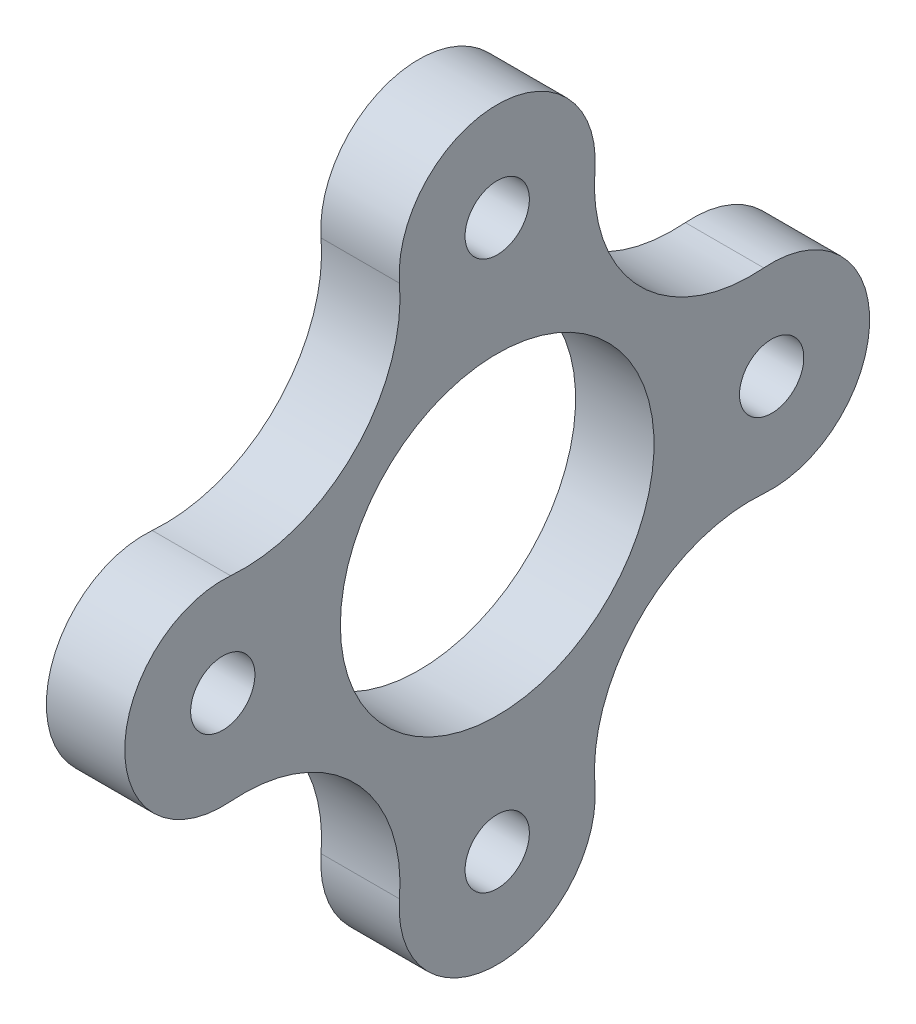
ISO-10303-21;
HEADER;
FILE_DESCRIPTION(('STEP AP214'),'2;1');
FILE_NAME('part.step','',(''),(''),'','','');
FILE_SCHEMA(('AUTOMOTIVE_DESIGN { 1 0 10303 214 1 1 1 1 }'));
ENDSEC;
DATA;
#1=APPLICATION_CONTEXT('core data for automotive mechanical design processes');
#2=APPLICATION_PROTOCOL_DEFINITION('international standard','automotive_design',2000,#1);
#3=PRODUCT_CONTEXT('',#1,'mechanical');
#4=PRODUCT('Part','Part','',(#3));
#5=PRODUCT_RELATED_PRODUCT_CATEGORY('part','',(#4));
#6=PRODUCT_DEFINITION_FORMATION('','',#4);
#7=PRODUCT_DEFINITION_CONTEXT('part definition',#1,'design');
#8=PRODUCT_DEFINITION('design','',#6,#7);
#9=PRODUCT_DEFINITION_SHAPE('','',#8);
#10=(LENGTH_UNIT() NAMED_UNIT(*) SI_UNIT(.MILLI.,.METRE.));
#11=(NAMED_UNIT(*) PLANE_ANGLE_UNIT() SI_UNIT($,.RADIAN.));
#12=(NAMED_UNIT(*) SI_UNIT($,.STERADIAN.) SOLID_ANGLE_UNIT());
#13=UNCERTAINTY_MEASURE_WITH_UNIT(LENGTH_MEASURE(1.E-05),#10,'distance_accuracy_value','');
#14=(GEOMETRIC_REPRESENTATION_CONTEXT(3) GLOBAL_UNCERTAINTY_ASSIGNED_CONTEXT((#13)) GLOBAL_UNIT_ASSIGNED_CONTEXT((#10,
#11,#12)) REPRESENTATION_CONTEXT('',''));
#15=CARTESIAN_POINT('',(0.,0.,0.));
#16=DIRECTION('',(0.,0.,1.));
#17=DIRECTION('',(1.,0.,0.));
#18=AXIS2_PLACEMENT_3D('',#15,#16,#17);
#19=CARTESIAN_POINT('',(26.9875000000025,197.217088487624,18.1914884336632));
#20=DIRECTION('',(-1.,0.,0.));
#21=DIRECTION('',(0.,0.,1.));
#22=AXIS2_PLACEMENT_3D('',#19,#20,#21);
#23=PLANE('',#22);
#24=CARTESIAN_POINT('',(26.9875000000025,186.931527045273,-25.4315730086876));
#25=DIRECTION('',(-1.,0.,0.));
#26=DIRECTION('',(0.,0.,1.));
#27=AXIS2_PLACEMENT_3D('',#24,#25,#26);
#28=CIRCLE('',#27,2.6035);
#29=CARTESIAN_POINT('',(26.9875000000025,186.931527045273,-22.8280730086876));
#30=VERTEX_POINT('',#29);
#31=EDGE_CURVE('E196',#30,#30,#28,.T.);
#32=ORIENTED_EDGE('',*,*,#31,.F.);
#33=EDGE_LOOP('',(#32));
#34=FACE_BOUND('',#33,.T.);
#35=CARTESIAN_POINT('',(26.9875000000025,186.931527045273,19.0184269913124));
#36=DIRECTION('',(-1.,0.,0.));
#37=DIRECTION('',(0.,0.,1.));
#38=AXIS2_PLACEMENT_3D('',#35,#36,#37);
#39=CIRCLE('',#38,2.6035);
#40=CARTESIAN_POINT('',(26.9875000000025,186.931527045273,21.6219269913124));
#41=VERTEX_POINT('',#40);
#42=EDGE_CURVE('E184',#41,#41,#39,.T.);
#43=ORIENTED_EDGE('',*,*,#42,.F.);
#44=EDGE_LOOP('',(#43));
#45=FACE_BOUND('',#44,.T.);
#46=CARTESIAN_POINT('',(26.9875000000025,186.931527045273,19.0184269913124));
#47=DIRECTION('',(-1.,0.,0.));
#48=DIRECTION('',(0.,0.,1.));
#49=AXIS2_PLACEMENT_3D('',#46,#47,#48);
#50=CIRCLE('',#49,7.93749999999999);
#51=CARTESIAN_POINT('',(26.9875000000025,179.019556705003,18.3823204085053));
#52=VERTEX_POINT('',#51);
#53=CARTESIAN_POINT('',(26.9875000000025,194.843497385543,18.3823204085053));
#54=VERTEX_POINT('',#53);
#55=EDGE_CURVE('E49',#52,#54,#50,.T.);
#56=ORIENTED_EDGE('',*,*,#55,.T.);
#57=CARTESIAN_POINT('',(26.9875000000025,207.502649929974,17.3645498760141));
#58=DIRECTION('',(1.,0.,0.));
#59=DIRECTION('',(0.,0.,-1.));
#60=AXIS2_PLACEMENT_3D('',#57,#58,#59);
#61=CIRCLE('',#60,12.7);
#62=CARTESIAN_POINT('',(26.9875000000025,208.520420462466,4.7053973315824));
#63=VERTEX_POINT('',#62);
#64=EDGE_CURVE('E92',#54,#63,#61,.T.);
#65=ORIENTED_EDGE('',*,*,#64,.T.);
#66=CARTESIAN_POINT('',(26.9875000000025,209.156527045273,-3.20657300868743));
#67=DIRECTION('',(-1.,0.,0.));
#68=DIRECTION('',(0.,0.,-1.));
#69=AXIS2_PLACEMENT_3D('',#66,#67,#68);
#70=CIRCLE('',#69,7.93750000000001);
#71=CARTESIAN_POINT('',(26.9875000000025,208.520420462466,-11.1185433489573));
#72=VERTEX_POINT('',#71);
#73=EDGE_CURVE('E162',#63,#72,#70,.T.);
#74=ORIENTED_EDGE('',*,*,#73,.T.);
#75=CARTESIAN_POINT('',(26.9875000000025,207.502649929975,-23.777695893389));
#76=DIRECTION('',(1.,0.,0.));
#77=DIRECTION('',(0.,0.,-1.));
#78=AXIS2_PLACEMENT_3D('',#75,#76,#77);
#79=CIRCLE('',#78,12.7);
#80=CARTESIAN_POINT('',(26.9875000000025,194.843497385543,-24.7954664258805));
#81=VERTEX_POINT('',#80);
#82=EDGE_CURVE('E175',#72,#81,#79,.T.);
#83=ORIENTED_EDGE('',*,*,#82,.T.);
#84=CARTESIAN_POINT('',(26.9875000000025,186.931527045273,-25.4315730086876));
#85=DIRECTION('',(-1.,0.,0.));
#86=DIRECTION('',(0.,0.,-1.));
#87=AXIS2_PLACEMENT_3D('',#84,#85,#86);
#88=CIRCLE('',#87,7.93750000000003);
#89=CARTESIAN_POINT('',(26.9875000000025,179.019556705003,-24.7954664258806));
#90=VERTEX_POINT('',#89);
#91=EDGE_CURVE('E112',#81,#90,#88,.T.);
#92=ORIENTED_EDGE('',*,*,#91,.T.);
#93=CARTESIAN_POINT('',(26.9875000000025,166.360404160572,-23.7776958933893));
#94=DIRECTION('',(1.,0.,0.));
#95=DIRECTION('',(0.,0.,-1.));
#96=AXIS2_PLACEMENT_3D('',#93,#94,#95);
#97=CIRCLE('',#96,12.7);
#98=CARTESIAN_POINT('',(26.9875000000025,165.34263362808,-11.1185433489576));
#99=VERTEX_POINT('',#98);
#100=EDGE_CURVE('E106',#90,#99,#97,.T.);
#101=ORIENTED_EDGE('',*,*,#100,.T.);
#102=CARTESIAN_POINT('',(26.9875000000025,164.706527045273,-3.20657300868771));
#103=DIRECTION('',(-1.,0.,0.));
#104=DIRECTION('',(0.,0.,-1.));
#105=AXIS2_PLACEMENT_3D('',#102,#103,#104);
#106=CIRCLE('',#105,7.93750000000002);
#107=CARTESIAN_POINT('',(26.9875000000025,165.34263362808,4.70539733158218));
#108=VERTEX_POINT('',#107);
#109=EDGE_CURVE('E110',#99,#108,#106,.T.);
#110=ORIENTED_EDGE('',*,*,#109,.T.);
#111=CARTESIAN_POINT('',(26.9875000000025,166.360404160572,17.3645498760139));
#112=DIRECTION('',(1.,0.,0.));
#113=DIRECTION('',(0.,0.,-1.));
#114=AXIS2_PLACEMENT_3D('',#111,#112,#113);
#115=CIRCLE('',#114,12.7);
#116=EDGE_CURVE('E127',#108,#52,#115,.T.);
#117=ORIENTED_EDGE('',*,*,#116,.T.);
#118=EDGE_LOOP('',(#56,#65,#74,#83,#92,#101,#110,#117));
#119=FACE_BOUND('',#118,.T.);
#120=CARTESIAN_POINT('',(26.9875000000025,186.931527045273,-3.20657300868764));
#121=DIRECTION('',(-1.,0.,0.));
#122=DIRECTION('',(0.,0.,1.));
#123=AXIS2_PLACEMENT_3D('',#120,#121,#122);
#124=CIRCLE('',#123,12.7);
#125=CARTESIAN_POINT('',(26.9875000000025,186.931527045273,9.49342699131235));
#126=VERTEX_POINT('',#125);
#127=EDGE_CURVE('E137',#126,#126,#124,.T.);
#128=ORIENTED_EDGE('',*,*,#127,.F.);
#129=EDGE_LOOP('',(#128));
#130=FACE_BOUND('',#129,.T.);
#131=CARTESIAN_POINT('',(26.9875000000025,164.706527045273,-3.20657300868765));
#132=DIRECTION('',(-1.,0.,0.));
#133=DIRECTION('',(0.,0.,1.));
#134=AXIS2_PLACEMENT_3D('',#131,#132,#133);
#135=CIRCLE('',#134,2.6035);
#136=CARTESIAN_POINT('',(26.9875000000025,164.706527045273,-0.60307300868765));
#137=VERTEX_POINT('',#136);
#138=EDGE_CURVE('E190',#137,#137,#135,.T.);
#139=ORIENTED_EDGE('',*,*,#138,.F.);
#140=EDGE_LOOP('',(#139));
#141=FACE_BOUND('',#140,.T.);
#142=CARTESIAN_POINT('',(26.9875000000025,209.156527045273,-3.20657300868763));
#143=DIRECTION('',(-1.,0.,0.));
#144=DIRECTION('',(0.,0.,1.));
#145=AXIS2_PLACEMENT_3D('',#142,#143,#144);
#146=CIRCLE('',#145,2.6035);
#147=CARTESIAN_POINT('',(26.9875000000025,209.156527045273,-0.603073008687632));
#148=VERTEX_POINT('',#147);
#149=EDGE_CURVE('E202',#148,#148,#146,.T.);
#150=ORIENTED_EDGE('',*,*,#149,.F.);
#151=EDGE_LOOP('',(#150));
#152=FACE_BOUND('',#151,.T.);
#153=ADVANCED_FACE('F32',(#34,#45,#119,#130,#141,#152),#23,.T.);
#154=CARTESIAN_POINT('',(33.3375000000025,197.217088487624,18.1914884336632));
#155=DIRECTION('',(-1.,0.,0.));
#156=DIRECTION('',(0.,0.,1.));
#157=AXIS2_PLACEMENT_3D('',#154,#155,#156);
#158=PLANE('',#157);
#159=CARTESIAN_POINT('',(33.3375000000025,207.502649929974,17.3645498760141));
#160=DIRECTION('',(1.,0.,0.));
#161=DIRECTION('',(0.,0.,-1.));
#162=AXIS2_PLACEMENT_3D('',#159,#160,#161);
#163=CIRCLE('',#162,12.7);
#164=CARTESIAN_POINT('',(33.3375000000025,194.843497385543,18.3823204085053));
#165=VERTEX_POINT('',#164);
#166=CARTESIAN_POINT('',(33.3375000000025,208.520420462466,4.7053973315824));
#167=VERTEX_POINT('',#166);
#168=EDGE_CURVE('E133',#165,#167,#163,.T.);
#169=ORIENTED_EDGE('',*,*,#168,.F.);
#170=CARTESIAN_POINT('',(33.3375000000025,186.931527045273,19.0184269913124));
#171=DIRECTION('',(-1.,0.,0.));
#172=DIRECTION('',(0.,0.,-1.));
#173=AXIS2_PLACEMENT_3D('',#170,#171,#172);
#174=CIRCLE('',#173,7.9375);
#175=CARTESIAN_POINT('',(33.3375000000025,179.019556705003,18.3823204085053));
#176=VERTEX_POINT('',#175);
#177=EDGE_CURVE('E147',#176,#165,#174,.T.);
#178=ORIENTED_EDGE('',*,*,#177,.F.);
#179=CARTESIAN_POINT('',(33.3375000000025,166.360404160572,17.3645498760139));
#180=DIRECTION('',(1.,0.,0.));
#181=DIRECTION('',(0.,0.,-1.));
#182=AXIS2_PLACEMENT_3D('',#179,#180,#181);
#183=CIRCLE('',#182,12.7);
#184=CARTESIAN_POINT('',(33.3375000000025,165.34263362808,4.70539733158218));
#185=VERTEX_POINT('',#184);
#186=EDGE_CURVE('E85',#185,#176,#183,.T.);
#187=ORIENTED_EDGE('',*,*,#186,.F.);
#188=CARTESIAN_POINT('',(33.3375000000025,164.706527045273,-3.20657300868765));
#189=DIRECTION('',(-1.,0.,0.));
#190=DIRECTION('',(0.,0.,1.));
#191=AXIS2_PLACEMENT_3D('',#188,#189,#190);
#192=CIRCLE('',#191,7.93750000000001);
#193=CARTESIAN_POINT('',(33.3375000000025,165.34263362808,-11.1185433489576));
#194=VERTEX_POINT('',#193);
#195=EDGE_CURVE('E78',#194,#185,#192,.T.);
#196=ORIENTED_EDGE('',*,*,#195,.F.);
#197=CARTESIAN_POINT('',(33.3375000000025,166.360404160572,-23.7776958933893));
#198=DIRECTION('',(1.,0.,0.));
#199=DIRECTION('',(0.,0.,-1.));
#200=AXIS2_PLACEMENT_3D('',#197,#198,#199);
#201=CIRCLE('',#200,12.7);
#202=CARTESIAN_POINT('',(33.3375000000025,179.019556705003,-24.7954664258806));
#203=VERTEX_POINT('',#202);
#204=EDGE_CURVE('E121',#203,#194,#201,.T.);
#205=ORIENTED_EDGE('',*,*,#204,.F.);
#206=CARTESIAN_POINT('',(33.3375000000025,186.931527045273,-25.4315730086877));
#207=DIRECTION('',(-1.,0.,0.));
#208=DIRECTION('',(0.,0.,1.));
#209=AXIS2_PLACEMENT_3D('',#206,#207,#208);
#210=CIRCLE('',#209,7.93750000000001);
#211=CARTESIAN_POINT('',(33.3375000000025,194.843497385543,-24.7954664258805));
#212=VERTEX_POINT('',#211);
#213=EDGE_CURVE('E142',#212,#203,#210,.T.);
#214=ORIENTED_EDGE('',*,*,#213,.F.);
#215=CARTESIAN_POINT('',(33.3375000000025,207.502649929975,-23.777695893389));
#216=DIRECTION('',(1.,0.,0.));
#217=DIRECTION('',(0.,0.,-1.));
#218=AXIS2_PLACEMENT_3D('',#215,#216,#217);
#219=CIRCLE('',#218,12.7);
#220=CARTESIAN_POINT('',(33.3375000000025,208.520420462466,-11.1185433489573));
#221=VERTEX_POINT('',#220);
#222=EDGE_CURVE('E139',#221,#212,#219,.T.);
#223=ORIENTED_EDGE('',*,*,#222,.F.);
#224=CARTESIAN_POINT('',(33.3375000000025,209.156527045273,-3.20657300868747));
#225=DIRECTION('',(-1.,0.,0.));
#226=DIRECTION('',(0.,0.,1.));
#227=AXIS2_PLACEMENT_3D('',#224,#225,#226);
#228=CIRCLE('',#227,7.93750000000001);
#229=EDGE_CURVE('E136',#167,#221,#228,.T.);
#230=ORIENTED_EDGE('',*,*,#229,.F.);
#231=EDGE_LOOP('',(#169,#178,#187,#196,#205,#214,#223,#230));
#232=FACE_BOUND('',#231,.T.);
#233=CARTESIAN_POINT('',(33.3375000000025,186.931527045273,-3.20657300868764));
#234=DIRECTION('',(-1.,0.,0.));
#235=DIRECTION('',(0.,0.,1.));
#236=AXIS2_PLACEMENT_3D('',#233,#234,#235);
#237=CIRCLE('',#236,12.7);
#238=CARTESIAN_POINT('',(33.3375000000025,186.931527045273,9.49342699131235));
#239=VERTEX_POINT('',#238);
#240=EDGE_CURVE('E181',#239,#239,#237,.T.);
#241=ORIENTED_EDGE('',*,*,#240,.T.);
#242=EDGE_LOOP('',(#241));
#243=FACE_BOUND('',#242,.T.);
#244=CARTESIAN_POINT('',(33.3375000000025,186.931527045273,19.0184269913124));
#245=DIRECTION('',(-1.,0.,0.));
#246=DIRECTION('',(0.,0.,1.));
#247=AXIS2_PLACEMENT_3D('',#244,#245,#246);
#248=CIRCLE('',#247,2.6035);
#249=CARTESIAN_POINT('',(33.3375000000025,186.931527045273,21.6219269913124));
#250=VERTEX_POINT('',#249);
#251=EDGE_CURVE('E187',#250,#250,#248,.T.);
#252=ORIENTED_EDGE('',*,*,#251,.T.);
#253=EDGE_LOOP('',(#252));
#254=FACE_BOUND('',#253,.T.);
#255=CARTESIAN_POINT('',(33.3375000000025,164.706527045273,-3.20657300868765));
#256=DIRECTION('',(-1.,0.,0.));
#257=DIRECTION('',(0.,0.,1.));
#258=AXIS2_PLACEMENT_3D('',#255,#256,#257);
#259=CIRCLE('',#258,2.6035);
#260=CARTESIAN_POINT('',(33.3375000000025,164.706527045273,-0.60307300868765));
#261=VERTEX_POINT('',#260);
#262=EDGE_CURVE('E193',#261,#261,#259,.T.);
#263=ORIENTED_EDGE('',*,*,#262,.T.);
#264=EDGE_LOOP('',(#263));
#265=FACE_BOUND('',#264,.T.);
#266=CARTESIAN_POINT('',(33.3375000000025,186.931527045273,-25.4315730086876));
#267=DIRECTION('',(-1.,0.,0.));
#268=DIRECTION('',(0.,0.,1.));
#269=AXIS2_PLACEMENT_3D('',#266,#267,#268);
#270=CIRCLE('',#269,2.6035);
#271=CARTESIAN_POINT('',(33.3375000000025,186.931527045273,-22.8280730086876));
#272=VERTEX_POINT('',#271);
#273=EDGE_CURVE('E199',#272,#272,#270,.T.);
#274=ORIENTED_EDGE('',*,*,#273,.T.);
#275=EDGE_LOOP('',(#274));
#276=FACE_BOUND('',#275,.T.);
#277=CARTESIAN_POINT('',(33.3375000000025,209.156527045273,-3.20657300868763));
#278=DIRECTION('',(-1.,0.,0.));
#279=DIRECTION('',(0.,0.,1.));
#280=AXIS2_PLACEMENT_3D('',#277,#278,#279);
#281=CIRCLE('',#280,2.6035);
#282=CARTESIAN_POINT('',(33.3375000000025,209.156527045273,-0.603073008687632));
#283=VERTEX_POINT('',#282);
#284=EDGE_CURVE('E205',#283,#283,#281,.T.);
#285=ORIENTED_EDGE('',*,*,#284,.T.);
#286=EDGE_LOOP('',(#285));
#287=FACE_BOUND('',#286,.T.);
#288=ADVANCED_FACE('F166',(#232,#243,#254,#265,#276,#287),#158,.F.);
#289=CARTESIAN_POINT('',(26.9875000000025,207.502649929974,17.3645498760141));
#290=DIRECTION('',(1.,0.,0.));
#291=DIRECTION('',(0.,0.,-1.));
#292=AXIS2_PLACEMENT_3D('',#289,#290,#291);
#293=CYLINDRICAL_SURFACE('',#292,12.7);
#294=ORIENTED_EDGE('',*,*,#168,.T.);
#295=DIRECTION('',(1.,0.,0.));
#296=VECTOR('',#295,1.);
#297=CARTESIAN_POINT('',(26.9875000000025,208.520420462466,4.7053973315824));
#298=LINE('',#297,#296);
#299=EDGE_CURVE('E41',#63,#167,#298,.T.);
#300=ORIENTED_EDGE('',*,*,#299,.F.);
#301=ORIENTED_EDGE('',*,*,#64,.F.);
#302=DIRECTION('',(1.,0.,0.));
#303=VECTOR('',#302,1.);
#304=CARTESIAN_POINT('',(26.9875000000025,194.843497385543,18.3823204085053));
#305=LINE('',#304,#303);
#306=EDGE_CURVE('E11',#54,#165,#305,.T.);
#307=ORIENTED_EDGE('',*,*,#306,.T.);
#308=EDGE_LOOP('',(#294,#300,#301,#307));
#309=FACE_BOUND('',#308,.T.);
#310=ADVANCED_FACE('F34',(#309),#293,.F.);
#311=CARTESIAN_POINT('',(26.9875000000025,209.156527045273,-3.20657300868747));
#312=DIRECTION('',(1.,0.,0.));
#313=DIRECTION('',(0.,0.,-1.));
#314=AXIS2_PLACEMENT_3D('',#311,#312,#313);
#315=CYLINDRICAL_SURFACE('',#314,7.93750000000001);
#316=ORIENTED_EDGE('',*,*,#229,.T.);
#317=DIRECTION('',(1.,0.,0.));
#318=VECTOR('',#317,1.);
#319=CARTESIAN_POINT('',(26.9875000000025,208.520420462466,-11.1185433489573));
#320=LINE('',#319,#318);
#321=EDGE_CURVE('E155',#72,#221,#320,.T.);
#322=ORIENTED_EDGE('',*,*,#321,.F.);
#323=ORIENTED_EDGE('',*,*,#73,.F.);
#324=ORIENTED_EDGE('',*,*,#299,.T.);
#325=EDGE_LOOP('',(#316,#322,#323,#324));
#326=FACE_BOUND('',#325,.T.);
#327=ADVANCED_FACE('F160',(#326),#315,.T.);
#328=CARTESIAN_POINT('',(26.9875000000025,207.502649929975,-23.777695893389));
#329=DIRECTION('',(1.,0.,0.));
#330=DIRECTION('',(0.,0.,-1.));
#331=AXIS2_PLACEMENT_3D('',#328,#329,#330);
#332=CYLINDRICAL_SURFACE('',#331,12.7);
#333=ORIENTED_EDGE('',*,*,#222,.T.);
#334=DIRECTION('',(1.,0.,0.));
#335=VECTOR('',#334,1.);
#336=CARTESIAN_POINT('',(26.9875000000025,194.843497385543,-24.7954664258805));
#337=LINE('',#336,#335);
#338=EDGE_CURVE('E152',#81,#212,#337,.T.);
#339=ORIENTED_EDGE('',*,*,#338,.F.);
#340=ORIENTED_EDGE('',*,*,#82,.F.);
#341=ORIENTED_EDGE('',*,*,#321,.T.);
#342=EDGE_LOOP('',(#333,#339,#340,#341));
#343=FACE_BOUND('',#342,.T.);
#344=ADVANCED_FACE('F171',(#343),#332,.F.);
#345=CARTESIAN_POINT('',(26.9875000000025,186.931527045273,-25.4315730086877));
#346=DIRECTION('',(1.,0.,0.));
#347=DIRECTION('',(0.,0.,-1.));
#348=AXIS2_PLACEMENT_3D('',#345,#346,#347);
#349=CYLINDRICAL_SURFACE('',#348,7.93750000000001);
#350=ORIENTED_EDGE('',*,*,#213,.T.);
#351=DIRECTION('',(1.,0.,0.));
#352=VECTOR('',#351,1.);
#353=CARTESIAN_POINT('',(26.9875000000025,179.019556705003,-24.7954664258806));
#354=LINE('',#353,#352);
#355=EDGE_CURVE('E122',#90,#203,#354,.T.);
#356=ORIENTED_EDGE('',*,*,#355,.F.);
#357=ORIENTED_EDGE('',*,*,#91,.F.);
#358=ORIENTED_EDGE('',*,*,#338,.T.);
#359=EDGE_LOOP('',(#350,#356,#357,#358));
#360=FACE_BOUND('',#359,.T.);
#361=ADVANCED_FACE('F174',(#360),#349,.T.);
#362=CARTESIAN_POINT('',(26.9875000000025,166.360404160572,-23.7776958933893));
#363=DIRECTION('',(1.,0.,0.));
#364=DIRECTION('',(0.,0.,-1.));
#365=AXIS2_PLACEMENT_3D('',#362,#363,#364);
#366=CYLINDRICAL_SURFACE('',#365,12.7);
#367=ORIENTED_EDGE('',*,*,#204,.T.);
#368=DIRECTION('',(1.,0.,0.));
#369=VECTOR('',#368,1.);
#370=CARTESIAN_POINT('',(26.9875000000025,165.34263362808,-11.1185433489576));
#371=LINE('',#370,#369);
#372=EDGE_CURVE('E118',#99,#194,#371,.T.);
#373=ORIENTED_EDGE('',*,*,#372,.F.);
#374=ORIENTED_EDGE('',*,*,#100,.F.);
#375=ORIENTED_EDGE('',*,*,#355,.T.);
#376=EDGE_LOOP('',(#367,#373,#374,#375));
#377=FACE_BOUND('',#376,.T.);
#378=ADVANCED_FACE('F119',(#377),#366,.F.);
#379=CARTESIAN_POINT('',(26.9875000000025,164.706527045273,-3.20657300868765));
#380=DIRECTION('',(1.,0.,0.));
#381=DIRECTION('',(0.,0.,-1.));
#382=AXIS2_PLACEMENT_3D('',#379,#380,#381);
#383=CYLINDRICAL_SURFACE('',#382,7.93750000000001);
#384=ORIENTED_EDGE('',*,*,#195,.T.);
#385=DIRECTION('',(1.,0.,0.));
#386=VECTOR('',#385,1.);
#387=CARTESIAN_POINT('',(26.9875000000025,165.34263362808,4.70539733158218));
#388=LINE('',#387,#386);
#389=EDGE_CURVE('E123',#108,#185,#388,.T.);
#390=ORIENTED_EDGE('',*,*,#389,.F.);
#391=ORIENTED_EDGE('',*,*,#109,.F.);
#392=ORIENTED_EDGE('',*,*,#372,.T.);
#393=EDGE_LOOP('',(#384,#390,#391,#392));
#394=FACE_BOUND('',#393,.T.);
#395=ADVANCED_FACE('F125',(#394),#383,.T.);
#396=CARTESIAN_POINT('',(26.9875000000025,166.360404160572,17.3645498760139));
#397=DIRECTION('',(1.,0.,0.));
#398=DIRECTION('',(0.,0.,-1.));
#399=AXIS2_PLACEMENT_3D('',#396,#397,#398);
#400=CYLINDRICAL_SURFACE('',#399,12.7);
#401=ORIENTED_EDGE('',*,*,#186,.T.);
#402=DIRECTION('',(1.,0.,0.));
#403=VECTOR('',#402,1.);
#404=CARTESIAN_POINT('',(26.9875000000025,179.019556705003,18.3823204085053));
#405=LINE('',#404,#403);
#406=EDGE_CURVE('E129',#52,#176,#405,.T.);
#407=ORIENTED_EDGE('',*,*,#406,.F.);
#408=ORIENTED_EDGE('',*,*,#116,.F.);
#409=ORIENTED_EDGE('',*,*,#389,.T.);
#410=EDGE_LOOP('',(#401,#407,#408,#409));
#411=FACE_BOUND('',#410,.T.);
#412=ADVANCED_FACE('F230',(#411),#400,.F.);
#413=CARTESIAN_POINT('',(26.9875000000025,186.931527045273,19.0184269913124));
#414=DIRECTION('',(1.,0.,0.));
#415=DIRECTION('',(0.,0.,-1.));
#416=AXIS2_PLACEMENT_3D('',#413,#414,#415);
#417=CYLINDRICAL_SURFACE('',#416,7.9375);
#418=ORIENTED_EDGE('',*,*,#177,.T.);
#419=ORIENTED_EDGE('',*,*,#306,.F.);
#420=ORIENTED_EDGE('',*,*,#55,.F.);
#421=ORIENTED_EDGE('',*,*,#406,.T.);
#422=EDGE_LOOP('',(#418,#419,#420,#421));
#423=FACE_BOUND('',#422,.T.);
#424=ADVANCED_FACE('F227',(#423),#417,.T.);
#425=CARTESIAN_POINT('',(26.9875000000025,186.931527045273,-3.20657300868764));
#426=DIRECTION('',(1.,0.,0.));
#427=DIRECTION('',(0.,0.,-1.));
#428=AXIS2_PLACEMENT_3D('',#425,#426,#427);
#429=CYLINDRICAL_SURFACE('',#428,12.7);
#430=ORIENTED_EDGE('',*,*,#127,.T.);
#431=EDGE_LOOP('',(#430));
#432=FACE_BOUND('',#431,.T.);
#433=ORIENTED_EDGE('',*,*,#240,.F.);
#434=EDGE_LOOP('',(#433));
#435=FACE_BOUND('',#434,.T.);
#436=ADVANCED_FACE('F224',(#432,#435),#429,.F.);
#437=CARTESIAN_POINT('',(26.9875000000025,186.931527045273,19.0184269913124));
#438=DIRECTION('',(1.,0.,0.));
#439=DIRECTION('',(0.,0.,-1.));
#440=AXIS2_PLACEMENT_3D('',#437,#438,#439);
#441=CYLINDRICAL_SURFACE('',#440,2.6035);
#442=ORIENTED_EDGE('',*,*,#42,.T.);
#443=EDGE_LOOP('',(#442));
#444=FACE_BOUND('',#443,.T.);
#445=ORIENTED_EDGE('',*,*,#251,.F.);
#446=EDGE_LOOP('',(#445));
#447=FACE_BOUND('',#446,.T.);
#448=ADVANCED_FACE('F312',(#444,#447),#441,.F.);
#449=CARTESIAN_POINT('',(26.9875000000025,164.706527045273,-3.20657300868765));
#450=DIRECTION('',(1.,0.,0.));
#451=DIRECTION('',(0.,0.,-1.));
#452=AXIS2_PLACEMENT_3D('',#449,#450,#451);
#453=CYLINDRICAL_SURFACE('',#452,2.6035);
#454=ORIENTED_EDGE('',*,*,#138,.T.);
#455=EDGE_LOOP('',(#454));
#456=FACE_BOUND('',#455,.T.);
#457=ORIENTED_EDGE('',*,*,#262,.F.);
#458=EDGE_LOOP('',(#457));
#459=FACE_BOUND('',#458,.T.);
#460=ADVANCED_FACE('F320',(#456,#459),#453,.F.);
#461=CARTESIAN_POINT('',(26.9875000000025,186.931527045273,-25.4315730086876));
#462=DIRECTION('',(1.,0.,0.));
#463=DIRECTION('',(0.,0.,-1.));
#464=AXIS2_PLACEMENT_3D('',#461,#462,#463);
#465=CYLINDRICAL_SURFACE('',#464,2.6035);
#466=ORIENTED_EDGE('',*,*,#31,.T.);
#467=EDGE_LOOP('',(#466));
#468=FACE_BOUND('',#467,.T.);
#469=ORIENTED_EDGE('',*,*,#273,.F.);
#470=EDGE_LOOP('',(#469));
#471=FACE_BOUND('',#470,.T.);
#472=ADVANCED_FACE('F328',(#468,#471),#465,.F.);
#473=CARTESIAN_POINT('',(26.9875000000025,209.156527045273,-3.20657300868763));
#474=DIRECTION('',(1.,0.,0.));
#475=DIRECTION('',(0.,0.,-1.));
#476=AXIS2_PLACEMENT_3D('',#473,#474,#475);
#477=CYLINDRICAL_SURFACE('',#476,2.6035);
#478=ORIENTED_EDGE('',*,*,#149,.T.);
#479=EDGE_LOOP('',(#478));
#480=FACE_BOUND('',#479,.T.);
#481=ORIENTED_EDGE('',*,*,#284,.F.);
#482=EDGE_LOOP('',(#481));
#483=FACE_BOUND('',#482,.T.);
#484=ADVANCED_FACE('F211',(#480,#483),#477,.F.);
#485=CLOSED_SHELL('',(#153,#288,#310,#327,#344,#361,#378,#395,#412,#424,#436,#448,#460,#472,#484));
#486=MANIFOLD_SOLID_BREP('B2',#485);
#487=ADVANCED_BREP_SHAPE_REPRESENTATION('',(#18,#486),#14);
#488=SHAPE_DEFINITION_REPRESENTATION(#9,#487);
ENDSEC;
END-ISO-10303-21;
